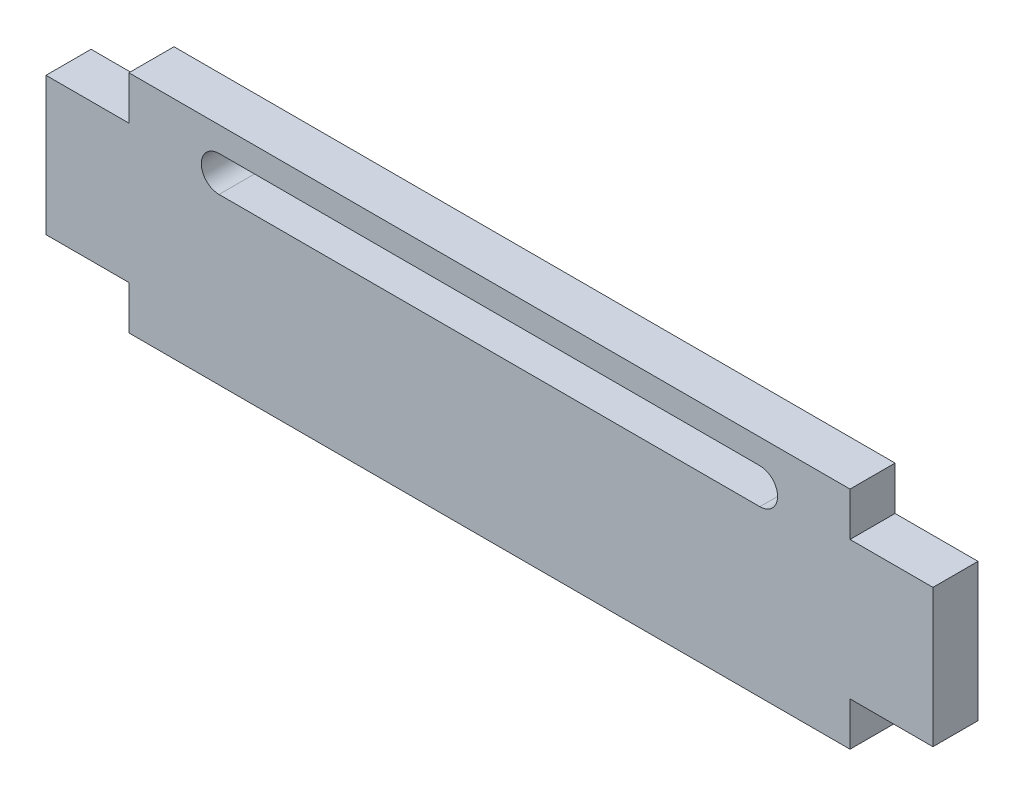
ISO-10303-21;
HEADER;
FILE_DESCRIPTION(('STEP AP214'),'2;1');
FILE_NAME('part.step','',(''),(''),'','','');
FILE_SCHEMA(('AUTOMOTIVE_DESIGN { 1 0 10303 214 1 1 1 1 }'));
ENDSEC;
DATA;
#1=APPLICATION_CONTEXT('core data for automotive mechanical design processes');
#2=APPLICATION_PROTOCOL_DEFINITION('international standard','automotive_design',2000,#1);
#3=PRODUCT_CONTEXT('',#1,'mechanical');
#4=PRODUCT('Part','Part','',(#3));
#5=PRODUCT_RELATED_PRODUCT_CATEGORY('part','',(#4));
#6=PRODUCT_DEFINITION_FORMATION('','',#4);
#7=PRODUCT_DEFINITION_CONTEXT('part definition',#1,'design');
#8=PRODUCT_DEFINITION('design','',#6,#7);
#9=PRODUCT_DEFINITION_SHAPE('','',#8);
#10=(LENGTH_UNIT() NAMED_UNIT(*) SI_UNIT(.MILLI.,.METRE.));
#11=(NAMED_UNIT(*) PLANE_ANGLE_UNIT() SI_UNIT($,.RADIAN.));
#12=(NAMED_UNIT(*) SI_UNIT($,.STERADIAN.) SOLID_ANGLE_UNIT());
#13=UNCERTAINTY_MEASURE_WITH_UNIT(LENGTH_MEASURE(1.E-05),#10,'distance_accuracy_value','');
#14=(GEOMETRIC_REPRESENTATION_CONTEXT(3) GLOBAL_UNCERTAINTY_ASSIGNED_CONTEXT((#13)) GLOBAL_UNIT_ASSIGNED_CONTEXT((#10,
#11,#12)) REPRESENTATION_CONTEXT('',''));
#15=CARTESIAN_POINT('',(0.,0.,0.));
#16=DIRECTION('',(0.,0.,1.));
#17=DIRECTION('',(1.,0.,0.));
#18=AXIS2_PLACEMENT_3D('',#15,#16,#17);
#19=CARTESIAN_POINT('',(0.,0.,3.175));
#20=DIRECTION('',(0.,0.,-1.));
#21=DIRECTION('',(-1.,0.,0.));
#22=AXIS2_PLACEMENT_3D('',#19,#20,#21);
#23=PLANE('',#22);
#24=DIRECTION('',(0.,1.,0.));
#25=VECTOR('',#24,1.);
#26=CARTESIAN_POINT('',(25.4,4.8625,3.175));
#27=LINE('',#26,#25);
#28=CARTESIAN_POINT('',(25.4,4.8625,3.175));
#29=VERTEX_POINT('',#28);
#30=CARTESIAN_POINT('',(25.4,7.9375,3.175));
#31=VERTEX_POINT('',#30);
#32=EDGE_CURVE('E184',#29,#31,#27,.T.);
#33=ORIENTED_EDGE('',*,*,#32,.T.);
#34=DIRECTION('',(-1.,0.,0.));
#35=VECTOR('',#34,1.);
#36=CARTESIAN_POINT('',(-25.4,7.9375,3.175));
#37=LINE('',#36,#35);
#38=CARTESIAN_POINT('',(-25.4,7.9375,3.175));
#39=VERTEX_POINT('',#38);
#40=EDGE_CURVE('E187',#31,#39,#37,.T.);
#41=ORIENTED_EDGE('',*,*,#40,.T.);
#42=DIRECTION('',(0.,-1.,0.));
#43=VECTOR('',#42,1.);
#44=CARTESIAN_POINT('',(-25.4,4.8625,3.175));
#45=LINE('',#44,#43);
#46=CARTESIAN_POINT('',(-25.4,4.8625,3.175));
#47=VERTEX_POINT('',#46);
#48=EDGE_CURVE('E190',#39,#47,#45,.T.);
#49=ORIENTED_EDGE('',*,*,#48,.T.);
#50=DIRECTION('',(-1.,0.,0.));
#51=VECTOR('',#50,1.);
#52=CARTESIAN_POINT('',(-31.242,4.86249999999999,3.175));
#53=LINE('',#52,#51);
#54=CARTESIAN_POINT('',(-31.242,4.86249999999999,3.175));
#55=VERTEX_POINT('',#54);
#56=EDGE_CURVE('E192',#47,#55,#53,.T.);
#57=ORIENTED_EDGE('',*,*,#56,.T.);
#58=DIRECTION('',(0.,-1.,0.));
#59=VECTOR('',#58,1.);
#60=CARTESIAN_POINT('',(-31.242,-4.86250000000001,3.175));
#61=LINE('',#60,#59);
#62=CARTESIAN_POINT('',(-31.242,-4.86250000000001,3.175));
#63=VERTEX_POINT('',#62);
#64=EDGE_CURVE('E194',#55,#63,#61,.T.);
#65=ORIENTED_EDGE('',*,*,#64,.T.);
#66=DIRECTION('',(1.,0.,0.));
#67=VECTOR('',#66,1.);
#68=CARTESIAN_POINT('',(-31.242,-4.86250000000001,3.175));
#69=LINE('',#68,#67);
#70=CARTESIAN_POINT('',(-25.4,-4.86250000000001,3.175));
#71=VERTEX_POINT('',#70);
#72=EDGE_CURVE('E196',#63,#71,#69,.T.);
#73=ORIENTED_EDGE('',*,*,#72,.T.);
#74=DIRECTION('',(0.,-1.,0.));
#75=VECTOR('',#74,1.);
#76=CARTESIAN_POINT('',(-25.4,-7.9375,3.175));
#77=LINE('',#76,#75);
#78=CARTESIAN_POINT('',(-25.4,-7.9375,3.175));
#79=VERTEX_POINT('',#78);
#80=EDGE_CURVE('E198',#71,#79,#77,.T.);
#81=ORIENTED_EDGE('',*,*,#80,.T.);
#82=DIRECTION('',(1.,0.,0.));
#83=VECTOR('',#82,1.);
#84=CARTESIAN_POINT('',(-25.4,-7.9375,3.175));
#85=LINE('',#84,#83);
#86=CARTESIAN_POINT('',(25.4,-7.9375,3.175));
#87=VERTEX_POINT('',#86);
#88=EDGE_CURVE('E200',#79,#87,#85,.T.);
#89=ORIENTED_EDGE('',*,*,#88,.T.);
#90=DIRECTION('',(0.,1.,0.));
#91=VECTOR('',#90,1.);
#92=CARTESIAN_POINT('',(25.4,-7.9375,3.175));
#93=LINE('',#92,#91);
#94=CARTESIAN_POINT('',(25.4,-4.8625,3.175));
#95=VERTEX_POINT('',#94);
#96=EDGE_CURVE('E202',#87,#95,#93,.T.);
#97=ORIENTED_EDGE('',*,*,#96,.T.);
#98=DIRECTION('',(1.,0.,0.));
#99=VECTOR('',#98,1.);
#100=CARTESIAN_POINT('',(31.242,-4.8625,3.175));
#101=LINE('',#100,#99);
#102=CARTESIAN_POINT('',(31.242,-4.8625,3.175));
#103=VERTEX_POINT('',#102);
#104=EDGE_CURVE('E204',#95,#103,#101,.T.);
#105=ORIENTED_EDGE('',*,*,#104,.T.);
#106=DIRECTION('',(0.,1.,0.));
#107=VECTOR('',#106,1.);
#108=CARTESIAN_POINT('',(31.242,-4.8625,3.175));
#109=LINE('',#108,#107);
#110=CARTESIAN_POINT('',(31.242,4.8625,3.175));
#111=VERTEX_POINT('',#110);
#112=EDGE_CURVE('E206',#103,#111,#109,.T.);
#113=ORIENTED_EDGE('',*,*,#112,.T.);
#114=DIRECTION('',(-1.,0.,0.));
#115=VECTOR('',#114,1.);
#116=CARTESIAN_POINT('',(31.242,4.8625,3.175));
#117=LINE('',#116,#115);
#118=EDGE_CURVE('E208',#111,#29,#117,.T.);
#119=ORIENTED_EDGE('',*,*,#118,.T.);
#120=EDGE_LOOP('',(#33,#41,#49,#57,#65,#73,#81,#89,#97,#105,#113,#119));
#121=FACE_BOUND('',#120,.T.);
#122=CARTESIAN_POINT('',(-19.05,4.9375,3.175));
#123=DIRECTION('',(0.,0.,1.));
#124=DIRECTION('',(1.,0.,0.));
#125=AXIS2_PLACEMENT_3D('',#122,#123,#124);
#126=CIRCLE('',#125,1.25);
#127=CARTESIAN_POINT('',(-19.05,6.1875,3.175));
#128=VERTEX_POINT('',#127);
#129=CARTESIAN_POINT('',(-19.05,3.6875,3.175));
#130=VERTEX_POINT('',#129);
#131=EDGE_CURVE('E148',#128,#130,#126,.T.);
#132=ORIENTED_EDGE('',*,*,#131,.F.);
#133=DIRECTION('',(-1.,0.,0.));
#134=VECTOR('',#133,1.);
#135=CARTESIAN_POINT('',(-19.05,6.1875,3.175));
#136=LINE('',#135,#134);
#137=CARTESIAN_POINT('',(19.05,6.18750000000001,3.175));
#138=VERTEX_POINT('',#137);
#139=EDGE_CURVE('E170',#138,#128,#136,.T.);
#140=ORIENTED_EDGE('',*,*,#139,.F.);
#141=CARTESIAN_POINT('',(19.05,4.9375,3.175));
#142=DIRECTION('',(0.,0.,1.));
#143=DIRECTION('',(1.,0.,0.));
#144=AXIS2_PLACEMENT_3D('',#141,#142,#143);
#145=CIRCLE('',#144,1.25);
#146=CARTESIAN_POINT('',(19.05,3.6875,3.175));
#147=VERTEX_POINT('',#146);
#148=EDGE_CURVE('E168',#147,#138,#145,.T.);
#149=ORIENTED_EDGE('',*,*,#148,.F.);
#150=DIRECTION('',(1.,0.,0.));
#151=VECTOR('',#150,1.);
#152=CARTESIAN_POINT('',(-19.05,3.6875,3.175));
#153=LINE('',#152,#151);
#154=EDGE_CURVE('E156',#130,#147,#153,.T.);
#155=ORIENTED_EDGE('',*,*,#154,.F.);
#156=EDGE_LOOP('',(#132,#140,#149,#155));
#157=FACE_BOUND('',#156,.T.);
#158=ADVANCED_FACE('F35',(#121,#157),#23,.F.);
#159=CARTESIAN_POINT('',(0.,0.,0.));
#160=DIRECTION('',(0.,0.,-1.));
#161=DIRECTION('',(-1.,0.,0.));
#162=AXIS2_PLACEMENT_3D('',#159,#160,#161);
#163=PLANE('',#162);
#164=DIRECTION('',(0.,1.,0.));
#165=VECTOR('',#164,1.);
#166=CARTESIAN_POINT('',(25.4,4.8625,0.));
#167=LINE('',#166,#165);
#168=CARTESIAN_POINT('',(25.4,4.8625,0.));
#169=VERTEX_POINT('',#168);
#170=CARTESIAN_POINT('',(25.4,7.9375,0.));
#171=VERTEX_POINT('',#170);
#172=EDGE_CURVE('E164',#169,#171,#167,.T.);
#173=ORIENTED_EDGE('',*,*,#172,.F.);
#174=DIRECTION('',(-1.,0.,0.));
#175=VECTOR('',#174,1.);
#176=CARTESIAN_POINT('',(31.242,4.8625,0.));
#177=LINE('',#176,#175);
#178=CARTESIAN_POINT('',(31.242,4.8625,0.));
#179=VERTEX_POINT('',#178);
#180=EDGE_CURVE('E188',#179,#169,#177,.T.);
#181=ORIENTED_EDGE('',*,*,#180,.F.);
#182=DIRECTION('',(0.,1.,0.));
#183=VECTOR('',#182,1.);
#184=CARTESIAN_POINT('',(31.242,-4.8625,0.));
#185=LINE('',#184,#183);
#186=CARTESIAN_POINT('',(31.242,-4.8625,0.));
#187=VERTEX_POINT('',#186);
#188=EDGE_CURVE('E231',#187,#179,#185,.T.);
#189=ORIENTED_EDGE('',*,*,#188,.F.);
#190=DIRECTION('',(1.,0.,0.));
#191=VECTOR('',#190,1.);
#192=CARTESIAN_POINT('',(31.242,-4.8625,0.));
#193=LINE('',#192,#191);
#194=CARTESIAN_POINT('',(25.4,-4.8625,0.));
#195=VERTEX_POINT('',#194);
#196=EDGE_CURVE('E229',#195,#187,#193,.T.);
#197=ORIENTED_EDGE('',*,*,#196,.F.);
#198=DIRECTION('',(0.,1.,0.));
#199=VECTOR('',#198,1.);
#200=CARTESIAN_POINT('',(25.4,-7.9375,0.));
#201=LINE('',#200,#199);
#202=CARTESIAN_POINT('',(25.4,-7.9375,0.));
#203=VERTEX_POINT('',#202);
#204=EDGE_CURVE('E227',#203,#195,#201,.T.);
#205=ORIENTED_EDGE('',*,*,#204,.F.);
#206=DIRECTION('',(1.,0.,0.));
#207=VECTOR('',#206,1.);
#208=CARTESIAN_POINT('',(-25.4,-7.9375,0.));
#209=LINE('',#208,#207);
#210=CARTESIAN_POINT('',(-25.4,-7.9375,0.));
#211=VERTEX_POINT('',#210);
#212=EDGE_CURVE('E225',#211,#203,#209,.T.);
#213=ORIENTED_EDGE('',*,*,#212,.F.);
#214=DIRECTION('',(0.,-1.,0.));
#215=VECTOR('',#214,1.);
#216=CARTESIAN_POINT('',(-25.4,-7.9375,0.));
#217=LINE('',#216,#215);
#218=CARTESIAN_POINT('',(-25.4,-4.86250000000001,0.));
#219=VERTEX_POINT('',#218);
#220=EDGE_CURVE('E223',#219,#211,#217,.T.);
#221=ORIENTED_EDGE('',*,*,#220,.F.);
#222=DIRECTION('',(1.,0.,0.));
#223=VECTOR('',#222,1.);
#224=CARTESIAN_POINT('',(-31.242,-4.86250000000001,0.));
#225=LINE('',#224,#223);
#226=CARTESIAN_POINT('',(-31.242,-4.86250000000001,0.));
#227=VERTEX_POINT('',#226);
#228=EDGE_CURVE('E221',#227,#219,#225,.T.);
#229=ORIENTED_EDGE('',*,*,#228,.F.);
#230=DIRECTION('',(0.,-1.,0.));
#231=VECTOR('',#230,1.);
#232=CARTESIAN_POINT('',(-31.242,-4.86250000000001,0.));
#233=LINE('',#232,#231);
#234=CARTESIAN_POINT('',(-31.242,4.86249999999999,0.));
#235=VERTEX_POINT('',#234);
#236=EDGE_CURVE('E219',#235,#227,#233,.T.);
#237=ORIENTED_EDGE('',*,*,#236,.F.);
#238=DIRECTION('',(-1.,0.,0.));
#239=VECTOR('',#238,1.);
#240=CARTESIAN_POINT('',(-31.242,4.86249999999999,0.));
#241=LINE('',#240,#239);
#242=CARTESIAN_POINT('',(-25.4,4.8625,0.));
#243=VERTEX_POINT('',#242);
#244=EDGE_CURVE('E217',#243,#235,#241,.T.);
#245=ORIENTED_EDGE('',*,*,#244,.F.);
#246=DIRECTION('',(0.,-1.,0.));
#247=VECTOR('',#246,1.);
#248=CARTESIAN_POINT('',(-25.4,4.8625,0.));
#249=LINE('',#248,#247);
#250=CARTESIAN_POINT('',(-25.4,7.9375,0.));
#251=VERTEX_POINT('',#250);
#252=EDGE_CURVE('E215',#251,#243,#249,.T.);
#253=ORIENTED_EDGE('',*,*,#252,.F.);
#254=DIRECTION('',(-1.,0.,0.));
#255=VECTOR('',#254,1.);
#256=CARTESIAN_POINT('',(-25.4,7.9375,0.));
#257=LINE('',#256,#255);
#258=EDGE_CURVE('E213',#171,#251,#257,.T.);
#259=ORIENTED_EDGE('',*,*,#258,.F.);
#260=EDGE_LOOP('',(#173,#181,#189,#197,#205,#213,#221,#229,#237,#245,#253,#259));
#261=FACE_BOUND('',#260,.T.);
#262=DIRECTION('',(-1.,0.,0.));
#263=VECTOR('',#262,1.);
#264=CARTESIAN_POINT('',(-19.05,6.1875,0.));
#265=LINE('',#264,#263);
#266=CARTESIAN_POINT('',(19.05,6.18750000000001,0.));
#267=VERTEX_POINT('',#266);
#268=CARTESIAN_POINT('',(-19.05,6.18750000000001,0.));
#269=VERTEX_POINT('',#268);
#270=EDGE_CURVE('E157',#267,#269,#265,.T.);
#271=ORIENTED_EDGE('',*,*,#270,.T.);
#272=CARTESIAN_POINT('',(-19.05,4.9375,0.));
#273=DIRECTION('',(0.,0.,1.));
#274=DIRECTION('',(1.,0.,0.));
#275=AXIS2_PLACEMENT_3D('',#272,#273,#274);
#276=CIRCLE('',#275,1.25);
#277=CARTESIAN_POINT('',(-19.05,3.6875,0.));
#278=VERTEX_POINT('',#277);
#279=EDGE_CURVE('E58',#269,#278,#276,.T.);
#280=ORIENTED_EDGE('',*,*,#279,.T.);
#281=DIRECTION('',(1.,0.,0.));
#282=VECTOR('',#281,1.);
#283=CARTESIAN_POINT('',(-19.05,3.6875,0.));
#284=LINE('',#283,#282);
#285=CARTESIAN_POINT('',(19.05,3.6875,0.));
#286=VERTEX_POINT('',#285);
#287=EDGE_CURVE('E163',#278,#286,#284,.T.);
#288=ORIENTED_EDGE('',*,*,#287,.T.);
#289=CARTESIAN_POINT('',(19.05,4.9375,0.));
#290=DIRECTION('',(0.,0.,1.));
#291=DIRECTION('',(1.,0.,0.));
#292=AXIS2_PLACEMENT_3D('',#289,#290,#291);
#293=CIRCLE('',#292,1.25);
#294=EDGE_CURVE('E176',#286,#267,#293,.T.);
#295=ORIENTED_EDGE('',*,*,#294,.T.);
#296=EDGE_LOOP('',(#271,#280,#288,#295));
#297=FACE_BOUND('',#296,.T.);
#298=ADVANCED_FACE('F273',(#261,#297),#163,.T.);
#299=CARTESIAN_POINT('',(25.4,4.8625,3.175));
#300=DIRECTION('',(-1.,0.,0.));
#301=DIRECTION('',(0.,-1.,0.));
#302=AXIS2_PLACEMENT_3D('',#299,#300,#301);
#303=PLANE('',#302);
#304=ORIENTED_EDGE('',*,*,#172,.T.);
#305=DIRECTION('',(0.,0.,-1.));
#306=VECTOR('',#305,1.);
#307=CARTESIAN_POINT('',(25.4,7.9375,3.175));
#308=LINE('',#307,#306);
#309=EDGE_CURVE('E11',#31,#171,#308,.T.);
#310=ORIENTED_EDGE('',*,*,#309,.F.);
#311=ORIENTED_EDGE('',*,*,#32,.F.);
#312=DIRECTION('',(0.,0.,-1.));
#313=VECTOR('',#312,1.);
#314=CARTESIAN_POINT('',(25.4,4.8625,3.175));
#315=LINE('',#314,#313);
#316=EDGE_CURVE('E210',#29,#169,#315,.T.);
#317=ORIENTED_EDGE('',*,*,#316,.T.);
#318=EDGE_LOOP('',(#304,#310,#311,#317));
#319=FACE_BOUND('',#318,.T.);
#320=ADVANCED_FACE('F37',(#319),#303,.F.);
#321=CARTESIAN_POINT('',(-25.4,7.9375,3.175));
#322=DIRECTION('',(0.,-1.,0.));
#323=DIRECTION('',(0.,0.,-1.));
#324=AXIS2_PLACEMENT_3D('',#321,#322,#323);
#325=PLANE('',#324);
#326=ORIENTED_EDGE('',*,*,#258,.T.);
#327=DIRECTION('',(0.,0.,-1.));
#328=VECTOR('',#327,1.);
#329=CARTESIAN_POINT('',(-25.4,7.9375,3.175));
#330=LINE('',#329,#328);
#331=EDGE_CURVE('E43',#39,#251,#330,.T.);
#332=ORIENTED_EDGE('',*,*,#331,.F.);
#333=ORIENTED_EDGE('',*,*,#40,.F.);
#334=ORIENTED_EDGE('',*,*,#309,.T.);
#335=EDGE_LOOP('',(#326,#332,#333,#334));
#336=FACE_BOUND('',#335,.T.);
#337=ADVANCED_FACE('F290',(#336),#325,.F.);
#338=CARTESIAN_POINT('',(-25.4,4.8625,3.175));
#339=DIRECTION('',(1.,0.,0.));
#340=DIRECTION('',(0.,1.,0.));
#341=AXIS2_PLACEMENT_3D('',#338,#339,#340);
#342=PLANE('',#341);
#343=ORIENTED_EDGE('',*,*,#252,.T.);
#344=DIRECTION('',(0.,0.,-1.));
#345=VECTOR('',#344,1.);
#346=CARTESIAN_POINT('',(-25.4,4.8625,3.175));
#347=LINE('',#346,#345);
#348=EDGE_CURVE('E260',#47,#243,#347,.T.);
#349=ORIENTED_EDGE('',*,*,#348,.F.);
#350=ORIENTED_EDGE('',*,*,#48,.F.);
#351=ORIENTED_EDGE('',*,*,#331,.T.);
#352=EDGE_LOOP('',(#343,#349,#350,#351));
#353=FACE_BOUND('',#352,.T.);
#354=ADVANCED_FACE('F267',(#353),#342,.F.);
#355=CARTESIAN_POINT('',(-31.242,4.86249999999999,3.175));
#356=DIRECTION('',(0.,-1.,0.));
#357=DIRECTION('',(1.,0.,0.));
#358=AXIS2_PLACEMENT_3D('',#355,#356,#357);
#359=PLANE('',#358);
#360=ORIENTED_EDGE('',*,*,#244,.T.);
#361=DIRECTION('',(0.,0.,-1.));
#362=VECTOR('',#361,1.);
#363=CARTESIAN_POINT('',(-31.242,4.86249999999999,3.175));
#364=LINE('',#363,#362);
#365=EDGE_CURVE('E257',#55,#235,#364,.T.);
#366=ORIENTED_EDGE('',*,*,#365,.F.);
#367=ORIENTED_EDGE('',*,*,#56,.F.);
#368=ORIENTED_EDGE('',*,*,#348,.T.);
#369=EDGE_LOOP('',(#360,#366,#367,#368));
#370=FACE_BOUND('',#369,.T.);
#371=ADVANCED_FACE('F279',(#370),#359,.F.);
#372=CARTESIAN_POINT('',(-31.242,-4.86250000000001,3.175));
#373=DIRECTION('',(1.,0.,0.));
#374=DIRECTION('',(0.,1.,0.));
#375=AXIS2_PLACEMENT_3D('',#372,#373,#374);
#376=PLANE('',#375);
#377=ORIENTED_EDGE('',*,*,#236,.T.);
#378=DIRECTION('',(0.,0.,-1.));
#379=VECTOR('',#378,1.);
#380=CARTESIAN_POINT('',(-31.242,-4.86250000000001,3.175));
#381=LINE('',#380,#379);
#382=EDGE_CURVE('E254',#63,#227,#381,.T.);
#383=ORIENTED_EDGE('',*,*,#382,.F.);
#384=ORIENTED_EDGE('',*,*,#64,.F.);
#385=ORIENTED_EDGE('',*,*,#365,.T.);
#386=EDGE_LOOP('',(#377,#383,#384,#385));
#387=FACE_BOUND('',#386,.T.);
#388=ADVANCED_FACE('F283',(#387),#376,.F.);
#389=CARTESIAN_POINT('',(-31.242,-4.86250000000001,3.175));
#390=DIRECTION('',(0.,1.,0.));
#391=DIRECTION('',(-1.,0.,0.));
#392=AXIS2_PLACEMENT_3D('',#389,#390,#391);
#393=PLANE('',#392);
#394=ORIENTED_EDGE('',*,*,#228,.T.);
#395=DIRECTION('',(0.,0.,-1.));
#396=VECTOR('',#395,1.);
#397=CARTESIAN_POINT('',(-25.4,-4.86250000000001,3.175));
#398=LINE('',#397,#396);
#399=EDGE_CURVE('E251',#71,#219,#398,.T.);
#400=ORIENTED_EDGE('',*,*,#399,.F.);
#401=ORIENTED_EDGE('',*,*,#72,.F.);
#402=ORIENTED_EDGE('',*,*,#382,.T.);
#403=EDGE_LOOP('',(#394,#400,#401,#402));
#404=FACE_BOUND('',#403,.T.);
#405=ADVANCED_FACE('F323',(#404),#393,.F.);
#406=CARTESIAN_POINT('',(-25.4,-7.9375,3.175));
#407=DIRECTION('',(1.,0.,0.));
#408=DIRECTION('',(0.,1.,0.));
#409=AXIS2_PLACEMENT_3D('',#406,#407,#408);
#410=PLANE('',#409);
#411=ORIENTED_EDGE('',*,*,#220,.T.);
#412=DIRECTION('',(0.,0.,-1.));
#413=VECTOR('',#412,1.);
#414=CARTESIAN_POINT('',(-25.4,-7.9375,3.175));
#415=LINE('',#414,#413);
#416=EDGE_CURVE('E248',#79,#211,#415,.T.);
#417=ORIENTED_EDGE('',*,*,#416,.F.);
#418=ORIENTED_EDGE('',*,*,#80,.F.);
#419=ORIENTED_EDGE('',*,*,#399,.T.);
#420=EDGE_LOOP('',(#411,#417,#418,#419));
#421=FACE_BOUND('',#420,.T.);
#422=ADVANCED_FACE('F321',(#421),#410,.F.);
#423=CARTESIAN_POINT('',(-25.4,-7.9375,3.175));
#424=DIRECTION('',(0.,1.,0.));
#425=DIRECTION('',(0.,0.,1.));
#426=AXIS2_PLACEMENT_3D('',#423,#424,#425);
#427=PLANE('',#426);
#428=ORIENTED_EDGE('',*,*,#212,.T.);
#429=DIRECTION('',(0.,0.,-1.));
#430=VECTOR('',#429,1.);
#431=CARTESIAN_POINT('',(25.4,-7.9375,3.175));
#432=LINE('',#431,#430);
#433=EDGE_CURVE('E245',#87,#203,#432,.T.);
#434=ORIENTED_EDGE('',*,*,#433,.F.);
#435=ORIENTED_EDGE('',*,*,#88,.F.);
#436=ORIENTED_EDGE('',*,*,#416,.T.);
#437=EDGE_LOOP('',(#428,#434,#435,#436));
#438=FACE_BOUND('',#437,.T.);
#439=ADVANCED_FACE('F317',(#438),#427,.F.);
#440=CARTESIAN_POINT('',(25.4,-7.9375,3.175));
#441=DIRECTION('',(-1.,0.,0.));
#442=DIRECTION('',(0.,-1.,0.));
#443=AXIS2_PLACEMENT_3D('',#440,#441,#442);
#444=PLANE('',#443);
#445=ORIENTED_EDGE('',*,*,#204,.T.);
#446=DIRECTION('',(0.,0.,-1.));
#447=VECTOR('',#446,1.);
#448=CARTESIAN_POINT('',(25.4,-4.8625,3.175));
#449=LINE('',#448,#447);
#450=EDGE_CURVE('E242',#95,#195,#449,.T.);
#451=ORIENTED_EDGE('',*,*,#450,.F.);
#452=ORIENTED_EDGE('',*,*,#96,.F.);
#453=ORIENTED_EDGE('',*,*,#433,.T.);
#454=EDGE_LOOP('',(#445,#451,#452,#453));
#455=FACE_BOUND('',#454,.T.);
#456=ADVANCED_FACE('F312',(#455),#444,.F.);
#457=CARTESIAN_POINT('',(31.242,-4.8625,3.175));
#458=DIRECTION('',(0.,1.,0.));
#459=DIRECTION('',(-1.,0.,0.));
#460=AXIS2_PLACEMENT_3D('',#457,#458,#459);
#461=PLANE('',#460);
#462=ORIENTED_EDGE('',*,*,#196,.T.);
#463=DIRECTION('',(0.,0.,-1.));
#464=VECTOR('',#463,1.);
#465=CARTESIAN_POINT('',(31.242,-4.8625,3.175));
#466=LINE('',#465,#464);
#467=EDGE_CURVE('E239',#103,#187,#466,.T.);
#468=ORIENTED_EDGE('',*,*,#467,.F.);
#469=ORIENTED_EDGE('',*,*,#104,.F.);
#470=ORIENTED_EDGE('',*,*,#450,.T.);
#471=EDGE_LOOP('',(#462,#468,#469,#470));
#472=FACE_BOUND('',#471,.T.);
#473=ADVANCED_FACE('F306',(#472),#461,.F.);
#474=CARTESIAN_POINT('',(31.242,-4.8625,3.175));
#475=DIRECTION('',(-1.,0.,0.));
#476=DIRECTION('',(0.,-1.,0.));
#477=AXIS2_PLACEMENT_3D('',#474,#475,#476);
#478=PLANE('',#477);
#479=ORIENTED_EDGE('',*,*,#188,.T.);
#480=DIRECTION('',(0.,0.,-1.));
#481=VECTOR('',#480,1.);
#482=CARTESIAN_POINT('',(31.242,4.8625,3.175));
#483=LINE('',#482,#481);
#484=EDGE_CURVE('E236',#111,#179,#483,.T.);
#485=ORIENTED_EDGE('',*,*,#484,.F.);
#486=ORIENTED_EDGE('',*,*,#112,.F.);
#487=ORIENTED_EDGE('',*,*,#467,.T.);
#488=EDGE_LOOP('',(#479,#485,#486,#487));
#489=FACE_BOUND('',#488,.T.);
#490=ADVANCED_FACE('F302',(#489),#478,.F.);
#491=CARTESIAN_POINT('',(31.242,4.8625,3.175));
#492=DIRECTION('',(0.,-1.,0.));
#493=DIRECTION('',(0.,0.,-1.));
#494=AXIS2_PLACEMENT_3D('',#491,#492,#493);
#495=PLANE('',#494);
#496=ORIENTED_EDGE('',*,*,#180,.T.);
#497=ORIENTED_EDGE('',*,*,#316,.F.);
#498=ORIENTED_EDGE('',*,*,#118,.F.);
#499=ORIENTED_EDGE('',*,*,#484,.T.);
#500=EDGE_LOOP('',(#496,#497,#498,#499));
#501=FACE_BOUND('',#500,.T.);
#502=ADVANCED_FACE('F297',(#501),#495,.F.);
#503=CARTESIAN_POINT('',(-19.05,4.9375,3.175));
#504=DIRECTION('',(0.,0.,-1.));
#505=DIRECTION('',(-1.,0.,0.));
#506=AXIS2_PLACEMENT_3D('',#503,#504,#505);
#507=CYLINDRICAL_SURFACE('',#506,1.25);
#508=ORIENTED_EDGE('',*,*,#279,.F.);
#509=DIRECTION('',(0.,0.,-1.));
#510=VECTOR('',#509,1.);
#511=CARTESIAN_POINT('',(-19.05,6.1875,3.175));
#512=LINE('',#511,#510);
#513=EDGE_CURVE('E152',#128,#269,#512,.T.);
#514=ORIENTED_EDGE('',*,*,#513,.F.);
#515=ORIENTED_EDGE('',*,*,#131,.T.);
#516=DIRECTION('',(0.,0.,-1.));
#517=VECTOR('',#516,1.);
#518=CARTESIAN_POINT('',(-19.05,3.6875,3.175));
#519=LINE('',#518,#517);
#520=EDGE_CURVE('E151',#130,#278,#519,.T.);
#521=ORIENTED_EDGE('',*,*,#520,.T.);
#522=EDGE_LOOP('',(#508,#514,#515,#521));
#523=FACE_BOUND('',#522,.T.);
#524=ADVANCED_FACE('F150',(#523),#507,.F.);
#525=CARTESIAN_POINT('',(-19.05,3.6875,3.175));
#526=DIRECTION('',(0.,1.,0.));
#527=DIRECTION('',(-1.,0.,0.));
#528=AXIS2_PLACEMENT_3D('',#525,#526,#527);
#529=PLANE('',#528);
#530=ORIENTED_EDGE('',*,*,#287,.F.);
#531=ORIENTED_EDGE('',*,*,#520,.F.);
#532=ORIENTED_EDGE('',*,*,#154,.T.);
#533=DIRECTION('',(0.,0.,-1.));
#534=VECTOR('',#533,1.);
#535=CARTESIAN_POINT('',(19.05,3.6875,3.175));
#536=LINE('',#535,#534);
#537=EDGE_CURVE('E165',#147,#286,#536,.T.);
#538=ORIENTED_EDGE('',*,*,#537,.T.);
#539=EDGE_LOOP('',(#530,#531,#532,#538));
#540=FACE_BOUND('',#539,.T.);
#541=ADVANCED_FACE('F160',(#540),#529,.T.);
#542=CARTESIAN_POINT('',(19.05,4.9375,3.175));
#543=DIRECTION('',(0.,0.,-1.));
#544=DIRECTION('',(-1.,0.,0.));
#545=AXIS2_PLACEMENT_3D('',#542,#543,#544);
#546=CYLINDRICAL_SURFACE('',#545,1.25);
#547=ORIENTED_EDGE('',*,*,#294,.F.);
#548=ORIENTED_EDGE('',*,*,#537,.F.);
#549=ORIENTED_EDGE('',*,*,#148,.T.);
#550=DIRECTION('',(0.,0.,-1.));
#551=VECTOR('',#550,1.);
#552=CARTESIAN_POINT('',(19.05,6.18750000000001,3.175));
#553=LINE('',#552,#551);
#554=EDGE_CURVE('E50',#138,#267,#553,.T.);
#555=ORIENTED_EDGE('',*,*,#554,.T.);
#556=EDGE_LOOP('',(#547,#548,#549,#555));
#557=FACE_BOUND('',#556,.T.);
#558=ADVANCED_FACE('F381',(#557),#546,.F.);
#559=CARTESIAN_POINT('',(-19.05,6.1875,3.175));
#560=DIRECTION('',(0.,-1.,0.));
#561=DIRECTION('',(1.,0.,0.));
#562=AXIS2_PLACEMENT_3D('',#559,#560,#561);
#563=PLANE('',#562);
#564=ORIENTED_EDGE('',*,*,#270,.F.);
#565=ORIENTED_EDGE('',*,*,#554,.F.);
#566=ORIENTED_EDGE('',*,*,#139,.T.);
#567=ORIENTED_EDGE('',*,*,#513,.T.);
#568=EDGE_LOOP('',(#564,#565,#566,#567));
#569=FACE_BOUND('',#568,.T.);
#570=ADVANCED_FACE('F387',(#569),#563,.T.);
#571=CLOSED_SHELL('',(#158,#298,#320,#337,#354,#371,#388,#405,#422,#439,#456,#473,#490,#502,
#524,#541,#558,#570));
#572=MANIFOLD_SOLID_BREP('B2',#571);
#573=ADVANCED_BREP_SHAPE_REPRESENTATION('',(#18,#572),#14);
#574=SHAPE_DEFINITION_REPRESENTATION(#9,#573);
ENDSEC;
END-ISO-10303-21;
